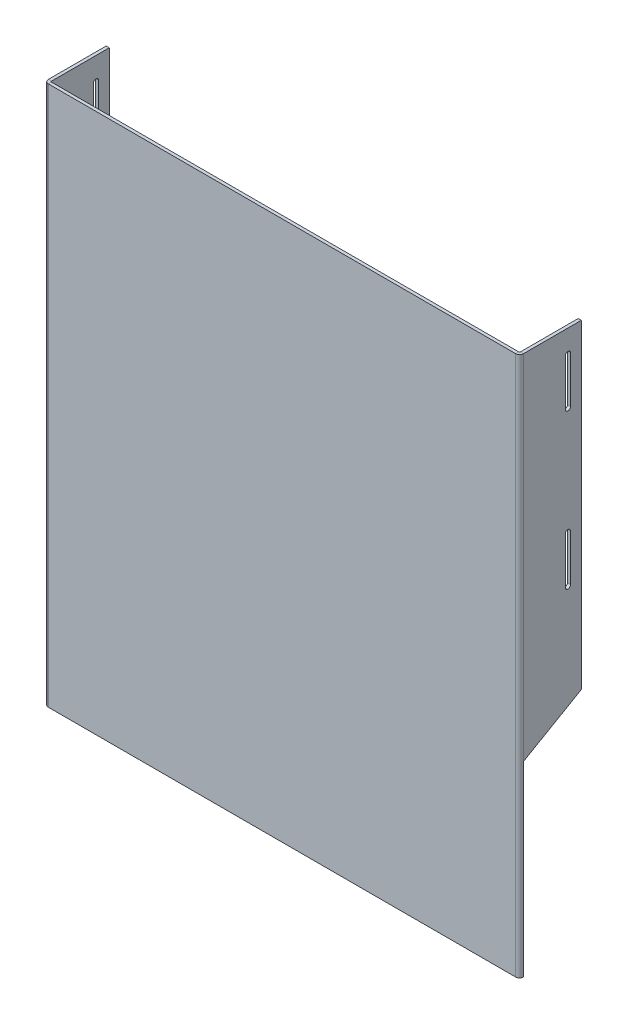
ISO-10303-21;
HEADER;
FILE_DESCRIPTION(('STEP AP214'),'2;1');
FILE_NAME('part.step','',(''),(''),'','','');
FILE_SCHEMA(('AUTOMOTIVE_DESIGN { 1 0 10303 214 1 1 1 1 }'));
ENDSEC;
DATA;
#1=APPLICATION_CONTEXT('core data for automotive mechanical design processes');
#2=APPLICATION_PROTOCOL_DEFINITION('international standard','automotive_design',2000,#1);
#3=PRODUCT_CONTEXT('',#1,'mechanical');
#4=PRODUCT('Part','Part','',(#3));
#5=PRODUCT_RELATED_PRODUCT_CATEGORY('part','',(#4));
#6=PRODUCT_DEFINITION_FORMATION('','',#4);
#7=PRODUCT_DEFINITION_CONTEXT('part definition',#1,'design');
#8=PRODUCT_DEFINITION('design','',#6,#7);
#9=PRODUCT_DEFINITION_SHAPE('','',#8);
#10=(LENGTH_UNIT() NAMED_UNIT(*) SI_UNIT(.MILLI.,.METRE.));
#11=(NAMED_UNIT(*) PLANE_ANGLE_UNIT() SI_UNIT($,.RADIAN.));
#12=(NAMED_UNIT(*) SI_UNIT($,.STERADIAN.) SOLID_ANGLE_UNIT());
#13=UNCERTAINTY_MEASURE_WITH_UNIT(LENGTH_MEASURE(1.E-05),#10,'distance_accuracy_value','');
#14=(GEOMETRIC_REPRESENTATION_CONTEXT(3) GLOBAL_UNCERTAINTY_ASSIGNED_CONTEXT((#13)) GLOBAL_UNIT_ASSIGNED_CONTEXT((#10,
#11,#12)) REPRESENTATION_CONTEXT('',''));
#15=CARTESIAN_POINT('',(0.,0.,0.));
#16=DIRECTION('',(0.,0.,1.));
#17=DIRECTION('',(1.,0.,0.));
#18=AXIS2_PLACEMENT_3D('',#15,#16,#17);
#19=CARTESIAN_POINT('',(2.5,0.,8.92239742839324E-13));
#20=DIRECTION('',(1.,0.,0.));
#21=DIRECTION('',(0.,0.,1.));
#22=AXIS2_PLACEMENT_3D('',#19,#20,#21);
#23=PLANE('',#22);
#24=DIRECTION('',(0.,-1.,0.));
#25=VECTOR('',#24,1.);
#26=CARTESIAN_POINT('',(2.50000000000001,0.,-2.49999999999999));
#27=LINE('',#26,#25);
#28=CARTESIAN_POINT('',(2.50000000000001,350.,-2.49999999999999));
#29=VERTEX_POINT('',#28);
#30=CARTESIAN_POINT('',(2.5,121.,-2.5));
#31=VERTEX_POINT('',#30);
#32=EDGE_CURVE('E373',#29,#31,#27,.T.);
#33=ORIENTED_EDGE('',*,*,#32,.T.);
#34=DIRECTION('',(0.,0.499999999999997,-0.86602540378444));
#35=VECTOR('',#34,1.);
#36=CARTESIAN_POINT('',(2.5,121.,-2.5));
#37=LINE('',#36,#35);
#38=CARTESIAN_POINT('',(2.50000000000017,142.650635094611,-40.));
#39=VERTEX_POINT('',#38);
#40=EDGE_CURVE('E348',#31,#39,#37,.T.);
#41=ORIENTED_EDGE('',*,*,#40,.T.);
#42=DIRECTION('',(0.,-1.,0.));
#43=VECTOR('',#42,1.);
#44=CARTESIAN_POINT('',(2.50000000000012,0.,-40.));
#45=LINE('',#44,#43);
#46=CARTESIAN_POINT('',(2.50000000000012,350.,-40.));
#47=VERTEX_POINT('',#46);
#48=EDGE_CURVE('E363',#39,#47,#45,.F.);
#49=ORIENTED_EDGE('',*,*,#48,.T.);
#50=DIRECTION('',(0.,0.,-1.));
#51=VECTOR('',#50,1.);
#52=CARTESIAN_POINT('',(2.5,350.,8.92239742839324E-13));
#53=LINE('',#52,#51);
#54=EDGE_CURVE('E365',#47,#29,#53,.F.);
#55=ORIENTED_EDGE('',*,*,#54,.T.);
#56=EDGE_LOOP('',(#33,#41,#49,#55));
#57=FACE_BOUND('',#56,.T.);
#58=DIRECTION('',(0.,1.,0.));
#59=VECTOR('',#58,1.);
#60=CARTESIAN_POINT('',(2.50000000000011,235.1372,-29.6559000000003));
#61=LINE('',#60,#59);
#62=CARTESIAN_POINT('',(2.50000000000011,205.1372,-29.6559000000002));
#63=VERTEX_POINT('',#62);
#64=CARTESIAN_POINT('',(2.50000000000009,235.1372,-29.6559000000003));
#65=VERTEX_POINT('',#64);
#66=EDGE_CURVE('E321',#63,#65,#61,.T.);
#67=ORIENTED_EDGE('',*,*,#66,.T.);
#68=CARTESIAN_POINT('',(2.50000000000011,235.1372,-31.3559000000002));
#69=DIRECTION('',(-1.,0.,0.));
#70=DIRECTION('',(0.,0.,1.));
#71=AXIS2_PLACEMENT_3D('',#68,#69,#70);
#72=CIRCLE('',#71,1.69999999999999);
#73=CARTESIAN_POINT('',(2.50000000000011,235.1372,-33.0559000000002));
#74=VERTEX_POINT('',#73);
#75=EDGE_CURVE('E318',#65,#74,#72,.T.);
#76=ORIENTED_EDGE('',*,*,#75,.T.);
#77=DIRECTION('',(0.,-1.,0.));
#78=VECTOR('',#77,1.);
#79=CARTESIAN_POINT('',(2.50000000000011,235.1372,-33.0559000000002));
#80=LINE('',#79,#78);
#81=CARTESIAN_POINT('',(2.50000000000011,205.1372,-33.0559000000002));
#82=VERTEX_POINT('',#81);
#83=EDGE_CURVE('E327',#74,#82,#80,.T.);
#84=ORIENTED_EDGE('',*,*,#83,.T.);
#85=CARTESIAN_POINT('',(2.50000000000011,205.1372,-31.3559000000002));
#86=DIRECTION('',(-1.,0.,0.));
#87=DIRECTION('',(0.,0.,1.));
#88=AXIS2_PLACEMENT_3D('',#85,#86,#87);
#89=CIRCLE('',#88,1.69999999999999);
#90=EDGE_CURVE('E324',#82,#63,#89,.T.);
#91=ORIENTED_EDGE('',*,*,#90,.T.);
#92=EDGE_LOOP('',(#67,#76,#84,#91));
#93=FACE_BOUND('',#92,.T.);
#94=DIRECTION('',(0.,1.,0.));
#95=VECTOR('',#94,1.);
#96=CARTESIAN_POINT('',(2.50000000000011,335.1372,-29.6559000000003));
#97=LINE('',#96,#95);
#98=CARTESIAN_POINT('',(2.50000000000011,305.1372,-29.6559000000002));
#99=VERTEX_POINT('',#98);
#100=CARTESIAN_POINT('',(2.50000000000009,335.1372,-29.6559000000003));
#101=VERTEX_POINT('',#100);
#102=EDGE_CURVE('E294',#99,#101,#97,.T.);
#103=ORIENTED_EDGE('',*,*,#102,.T.);
#104=CARTESIAN_POINT('',(2.50000000000011,335.1372,-31.3559000000002));
#105=DIRECTION('',(-1.,0.,0.));
#106=DIRECTION('',(0.,0.,1.));
#107=AXIS2_PLACEMENT_3D('',#104,#105,#106);
#108=CIRCLE('',#107,1.69999999999999);
#109=CARTESIAN_POINT('',(2.50000000000011,335.1372,-33.0559000000002));
#110=VERTEX_POINT('',#109);
#111=EDGE_CURVE('E94',#101,#110,#108,.T.);
#112=ORIENTED_EDGE('',*,*,#111,.T.);
#113=DIRECTION('',(0.,-1.,0.));
#114=VECTOR('',#113,1.);
#115=CARTESIAN_POINT('',(2.50000000000011,335.1372,-33.0559000000002));
#116=LINE('',#115,#114);
#117=CARTESIAN_POINT('',(2.50000000000011,305.1372,-33.0559000000002));
#118=VERTEX_POINT('',#117);
#119=EDGE_CURVE('E288',#110,#118,#116,.T.);
#120=ORIENTED_EDGE('',*,*,#119,.T.);
#121=CARTESIAN_POINT('',(2.50000000000011,305.1372,-31.3559000000002));
#122=DIRECTION('',(-1.,0.,0.));
#123=DIRECTION('',(0.,0.,1.));
#124=AXIS2_PLACEMENT_3D('',#121,#122,#123);
#125=CIRCLE('',#124,1.69999999999999);
#126=EDGE_CURVE('E301',#118,#99,#125,.T.);
#127=ORIENTED_EDGE('',*,*,#126,.T.);
#128=EDGE_LOOP('',(#103,#112,#120,#127));
#129=FACE_BOUND('',#128,.T.);
#130=ADVANCED_FACE('F77',(#57,#93,#129),#23,.T.);
#131=CARTESIAN_POINT('',(0.499999999999998,0.,8.85256780161638E-13));
#132=DIRECTION('',(1.,0.,0.));
#133=DIRECTION('',(0.,0.,1.));
#134=AXIS2_PLACEMENT_3D('',#131,#132,#133);
#135=PLANE('',#134);
#136=CARTESIAN_POINT('',(0.500000000000111,235.1372,-31.3559000000003));
#137=DIRECTION('',(1.,0.,0.));
#138=DIRECTION('',(0.,0.,-1.));
#139=AXIS2_PLACEMENT_3D('',#136,#137,#138);
#140=CIRCLE('',#139,1.69999999999999);
#141=CARTESIAN_POINT('',(0.500000000000111,235.1372,-33.0559000000002));
#142=VERTEX_POINT('',#141);
#143=CARTESIAN_POINT('',(0.500000000000111,235.1372,-29.6559000000003));
#144=VERTEX_POINT('',#143);
#145=EDGE_CURVE('E315',#142,#144,#140,.T.);
#146=ORIENTED_EDGE('',*,*,#145,.T.);
#147=DIRECTION('',(0.,-1.,0.));
#148=VECTOR('',#147,1.);
#149=CARTESIAN_POINT('',(0.500000000000111,235.1372,-29.6559000000003));
#150=LINE('',#149,#148);
#151=CARTESIAN_POINT('',(0.500000000000085,205.1372,-29.6559000000003));
#152=VERTEX_POINT('',#151);
#153=EDGE_CURVE('E333',#144,#152,#150,.T.);
#154=ORIENTED_EDGE('',*,*,#153,.T.);
#155=CARTESIAN_POINT('',(0.500000000000111,205.1372,-31.3559000000002));
#156=DIRECTION('',(1.,0.,0.));
#157=DIRECTION('',(0.,0.,-1.));
#158=AXIS2_PLACEMENT_3D('',#155,#156,#157);
#159=CIRCLE('',#158,1.69999999999999);
#160=CARTESIAN_POINT('',(0.500000000000116,205.1372,-33.0559000000002));
#161=VERTEX_POINT('',#160);
#162=EDGE_CURVE('E282',#152,#161,#159,.T.);
#163=ORIENTED_EDGE('',*,*,#162,.T.);
#164=DIRECTION('',(0.,1.,0.));
#165=VECTOR('',#164,1.);
#166=CARTESIAN_POINT('',(0.500000000000111,235.1372,-33.0559000000002));
#167=LINE('',#166,#165);
#168=EDGE_CURVE('E312',#161,#142,#167,.T.);
#169=ORIENTED_EDGE('',*,*,#168,.T.);
#170=EDGE_LOOP('',(#146,#154,#163,#169));
#171=FACE_BOUND('',#170,.T.);
#172=DIRECTION('',(0.,-0.499999999999997,0.86602540378444));
#173=VECTOR('',#172,1.);
#174=CARTESIAN_POINT('',(0.5,121.,-2.50000000000021));
#175=LINE('',#174,#173);
#176=CARTESIAN_POINT('',(0.500000000000115,142.650635094611,-40.));
#177=VERTEX_POINT('',#176);
#178=CARTESIAN_POINT('',(0.500000000000003,121.,-2.5));
#179=VERTEX_POINT('',#178);
#180=EDGE_CURVE('E345',#177,#179,#175,.T.);
#181=ORIENTED_EDGE('',*,*,#180,.T.);
#182=DIRECTION('',(0.,1.,0.));
#183=VECTOR('',#182,1.);
#184=CARTESIAN_POINT('',(0.500000000000006,350.,-2.5));
#185=LINE('',#184,#183);
#186=CARTESIAN_POINT('',(0.500000000000006,350.,-2.5));
#187=VERTEX_POINT('',#186);
#188=EDGE_CURVE('E379',#187,#179,#185,.F.);
#189=ORIENTED_EDGE('',*,*,#188,.F.);
#190=DIRECTION('',(0.,0.,1.));
#191=VECTOR('',#190,1.);
#192=CARTESIAN_POINT('',(0.500000000000004,350.,-2.));
#193=LINE('',#192,#191);
#194=CARTESIAN_POINT('',(0.500000000000115,350.,-40.));
#195=VERTEX_POINT('',#194);
#196=EDGE_CURVE('E370',#195,#187,#193,.T.);
#197=ORIENTED_EDGE('',*,*,#196,.F.);
#198=DIRECTION('',(0.,1.,0.));
#199=VECTOR('',#198,1.);
#200=CARTESIAN_POINT('',(0.500000000000115,350.,-40.));
#201=LINE('',#200,#199);
#202=EDGE_CURVE('E368',#177,#195,#201,.T.);
#203=ORIENTED_EDGE('',*,*,#202,.F.);
#204=EDGE_LOOP('',(#181,#189,#197,#203));
#205=FACE_BOUND('',#204,.T.);
#206=CARTESIAN_POINT('',(0.500000000000111,335.1372,-31.3559000000003));
#207=DIRECTION('',(1.,0.,0.));
#208=DIRECTION('',(0.,0.,-1.));
#209=AXIS2_PLACEMENT_3D('',#206,#207,#208);
#210=CIRCLE('',#209,1.69999999999999);
#211=CARTESIAN_POINT('',(0.500000000000111,335.1372,-33.0559000000002));
#212=VERTEX_POINT('',#211);
#213=CARTESIAN_POINT('',(0.500000000000111,335.1372,-29.6559000000003));
#214=VERTEX_POINT('',#213);
#215=EDGE_CURVE('E286',#212,#214,#210,.T.);
#216=ORIENTED_EDGE('',*,*,#215,.T.);
#217=DIRECTION('',(0.,-1.,0.));
#218=VECTOR('',#217,1.);
#219=CARTESIAN_POINT('',(0.500000000000111,335.1372,-29.6559000000003));
#220=LINE('',#219,#218);
#221=CARTESIAN_POINT('',(0.500000000000085,305.1372,-29.6559000000003));
#222=VERTEX_POINT('',#221);
#223=EDGE_CURVE('E275',#214,#222,#220,.T.);
#224=ORIENTED_EDGE('',*,*,#223,.T.);
#225=CARTESIAN_POINT('',(0.500000000000111,305.1372,-31.3559000000002));
#226=DIRECTION('',(1.,0.,0.));
#227=DIRECTION('',(0.,0.,-1.));
#228=AXIS2_PLACEMENT_3D('',#225,#226,#227);
#229=CIRCLE('',#228,1.69999999999999);
#230=CARTESIAN_POINT('',(0.500000000000116,305.1372,-33.0559000000002));
#231=VERTEX_POINT('',#230);
#232=EDGE_CURVE('E296',#222,#231,#229,.T.);
#233=ORIENTED_EDGE('',*,*,#232,.T.);
#234=DIRECTION('',(0.,1.,0.));
#235=VECTOR('',#234,1.);
#236=CARTESIAN_POINT('',(0.500000000000111,335.1372,-33.0559000000002));
#237=LINE('',#236,#235);
#238=EDGE_CURVE('E292',#231,#212,#237,.T.);
#239=ORIENTED_EDGE('',*,*,#238,.T.);
#240=EDGE_LOOP('',(#216,#224,#233,#239));
#241=FACE_BOUND('',#240,.T.);
#242=ADVANCED_FACE('F291',(#171,#205,#241),#135,.F.);
#243=CARTESIAN_POINT('',(2.50000000000011,350.,-40.));
#244=DIRECTION('',(0.,0.,1.));
#245=DIRECTION('',(1.,0.,0.));
#246=AXIS2_PLACEMENT_3D('',#243,#244,#245);
#247=PLANE('',#246);
#248=DIRECTION('',(1.,0.,0.));
#249=VECTOR('',#248,1.);
#250=CARTESIAN_POINT('',(-305.501,142.650635094611,-40.0000000000012));
#251=LINE('',#250,#249);
#252=EDGE_CURVE('E354',#177,#39,#251,.T.);
#253=ORIENTED_EDGE('',*,*,#252,.F.);
#254=ORIENTED_EDGE('',*,*,#202,.T.);
#255=DIRECTION('',(-1.,0.,0.));
#256=VECTOR('',#255,1.);
#257=CARTESIAN_POINT('',(2.50000000000013,350.,-40.));
#258=LINE('',#257,#256);
#259=EDGE_CURVE('E359',#47,#195,#258,.T.);
#260=ORIENTED_EDGE('',*,*,#259,.F.);
#261=ORIENTED_EDGE('',*,*,#48,.F.);
#262=EDGE_LOOP('',(#253,#254,#260,#261));
#263=FACE_BOUND('',#262,.T.);
#264=ADVANCED_FACE('F570',(#263),#247,.F.);
#265=CARTESIAN_POINT('',(0.,0.,-2.));
#266=DIRECTION('',(0.,-1.,0.));
#267=DIRECTION('',(1.,0.,0.));
#268=AXIS2_PLACEMENT_3D('',#265,#266,#267);
#269=PLANE('',#268);
#270=DIRECTION('',(1.,0.,0.));
#271=VECTOR('',#270,1.);
#272=CARTESIAN_POINT('',(0.,0.,0.));
#273=LINE('',#272,#271);
#274=CARTESIAN_POINT('',(-303.,0.,0.));
#275=VERTEX_POINT('',#274);
#276=CARTESIAN_POINT('',(0.,0.,0.));
#277=VERTEX_POINT('',#276);
#278=EDGE_CURVE('E509',#275,#277,#273,.T.);
#279=ORIENTED_EDGE('',*,*,#278,.F.);
#280=DIRECTION('',(0.,0.,1.));
#281=VECTOR('',#280,1.);
#282=CARTESIAN_POINT('',(-303.,0.,-2.));
#283=LINE('',#282,#281);
#284=CARTESIAN_POINT('',(-303.,0.,-2.));
#285=VERTEX_POINT('',#284);
#286=EDGE_CURVE('E86',#285,#275,#283,.T.);
#287=ORIENTED_EDGE('',*,*,#286,.F.);
#288=DIRECTION('',(1.,0.,0.));
#289=VECTOR('',#288,1.);
#290=CARTESIAN_POINT('',(0.,0.,-2.));
#291=LINE('',#290,#289);
#292=CARTESIAN_POINT('',(0.,0.,-1.99999999999999));
#293=VERTEX_POINT('',#292);
#294=EDGE_CURVE('E514',#285,#293,#291,.T.);
#295=ORIENTED_EDGE('',*,*,#294,.T.);
#296=DIRECTION('',(0.,0.,1.));
#297=VECTOR('',#296,1.);
#298=CARTESIAN_POINT('',(0.,0.,-2.));
#299=LINE('',#298,#297);
#300=EDGE_CURVE('E13',#293,#277,#299,.T.);
#301=ORIENTED_EDGE('',*,*,#300,.T.);
#302=EDGE_LOOP('',(#279,#287,#295,#301));
#303=FACE_BOUND('',#302,.T.);
#304=ADVANCED_FACE('F548',(#303),#269,.T.);
#305=CARTESIAN_POINT('',(0.,350.,-2.));
#306=DIRECTION('',(0.,1.,0.));
#307=DIRECTION('',(-1.,0.,0.));
#308=AXIS2_PLACEMENT_3D('',#305,#306,#307);
#309=PLANE('',#308);
#310=DIRECTION('',(-1.,0.,0.));
#311=VECTOR('',#310,1.);
#312=CARTESIAN_POINT('',(0.,350.,0.));
#313=LINE('',#312,#311);
#314=CARTESIAN_POINT('',(0.,350.,0.));
#315=VERTEX_POINT('',#314);
#316=CARTESIAN_POINT('',(-303.,350.,0.));
#317=VERTEX_POINT('',#316);
#318=EDGE_CURVE('E519',#315,#317,#313,.T.);
#319=ORIENTED_EDGE('',*,*,#318,.F.);
#320=DIRECTION('',(0.,0.,1.));
#321=VECTOR('',#320,1.);
#322=CARTESIAN_POINT('',(0.,350.,-2.));
#323=LINE('',#322,#321);
#324=CARTESIAN_POINT('',(0.,350.,-1.99999999999999));
#325=VERTEX_POINT('',#324);
#326=EDGE_CURVE('E81',#325,#315,#323,.T.);
#327=ORIENTED_EDGE('',*,*,#326,.F.);
#328=DIRECTION('',(-1.,0.,0.));
#329=VECTOR('',#328,1.);
#330=CARTESIAN_POINT('',(0.,350.,-2.));
#331=LINE('',#330,#329);
#332=CARTESIAN_POINT('',(-303.,350.,-2.));
#333=VERTEX_POINT('',#332);
#334=EDGE_CURVE('E508',#325,#333,#331,.T.);
#335=ORIENTED_EDGE('',*,*,#334,.T.);
#336=DIRECTION('',(0.,0.,1.));
#337=VECTOR('',#336,1.);
#338=CARTESIAN_POINT('',(-303.,350.,-2.));
#339=LINE('',#338,#337);
#340=EDGE_CURVE('E528',#333,#317,#339,.T.);
#341=ORIENTED_EDGE('',*,*,#340,.T.);
#342=EDGE_LOOP('',(#319,#327,#335,#341));
#343=FACE_BOUND('',#342,.T.);
#344=ADVANCED_FACE('F79',(#343),#309,.T.);
#345=CARTESIAN_POINT('',(0.,0.,-2.));
#346=DIRECTION('',(0.,0.,1.));
#347=DIRECTION('',(1.,0.,0.));
#348=AXIS2_PLACEMENT_3D('',#345,#346,#347);
#349=PLANE('',#348);
#350=DIRECTION('',(0.,1.,0.));
#351=VECTOR('',#350,1.);
#352=CARTESIAN_POINT('',(0.,0.,-2.));
#353=LINE('',#352,#351);
#354=EDGE_CURVE('E506',#293,#325,#353,.T.);
#355=ORIENTED_EDGE('',*,*,#354,.F.);
#356=ORIENTED_EDGE('',*,*,#294,.F.);
#357=DIRECTION('',(0.,-1.,0.));
#358=VECTOR('',#357,1.);
#359=CARTESIAN_POINT('',(-303.,0.,-2.));
#360=LINE('',#359,#358);
#361=EDGE_CURVE('E512',#333,#285,#360,.T.);
#362=ORIENTED_EDGE('',*,*,#361,.F.);
#363=ORIENTED_EDGE('',*,*,#334,.F.);
#364=EDGE_LOOP('',(#355,#356,#362,#363));
#365=FACE_BOUND('',#364,.T.);
#366=ADVANCED_FACE('F554',(#365),#349,.F.);
#367=CARTESIAN_POINT('',(0.,0.,0.));
#368=DIRECTION('',(0.,0.,1.));
#369=DIRECTION('',(1.,0.,0.));
#370=AXIS2_PLACEMENT_3D('',#367,#368,#369);
#371=PLANE('',#370);
#372=DIRECTION('',(0.,1.,0.));
#373=VECTOR('',#372,1.);
#374=CARTESIAN_POINT('',(0.,0.,0.));
#375=LINE('',#374,#373);
#376=EDGE_CURVE('E497',#277,#315,#375,.T.);
#377=ORIENTED_EDGE('',*,*,#376,.T.);
#378=ORIENTED_EDGE('',*,*,#318,.T.);
#379=DIRECTION('',(0.,-1.,0.));
#380=VECTOR('',#379,1.);
#381=CARTESIAN_POINT('',(-303.,0.,0.));
#382=LINE('',#381,#380);
#383=EDGE_CURVE('E522',#317,#275,#382,.T.);
#384=ORIENTED_EDGE('',*,*,#383,.T.);
#385=ORIENTED_EDGE('',*,*,#278,.T.);
#386=EDGE_LOOP('',(#377,#378,#384,#385));
#387=FACE_BOUND('',#386,.T.);
#388=ADVANCED_FACE('F539',(#387),#371,.T.);
#389=CARTESIAN_POINT('',(-303.,0.,-2.5));
#390=DIRECTION('',(0.,-1.,0.));
#391=DIRECTION('',(0.,0.,-1.));
#392=AXIS2_PLACEMENT_3D('',#389,#390,#391);
#393=PLANE('',#392);
#394=DIRECTION('',(-1.,0.,0.));
#395=VECTOR('',#394,1.);
#396=CARTESIAN_POINT('',(-305.5,0.,-2.5));
#397=LINE('',#396,#395);
#398=CARTESIAN_POINT('',(-303.5,0.,-2.5));
#399=VERTEX_POINT('',#398);
#400=CARTESIAN_POINT('',(-305.5,0.,-2.50000000000025));
#401=VERTEX_POINT('',#400);
#402=EDGE_CURVE('E466',#399,#401,#397,.T.);
#403=ORIENTED_EDGE('',*,*,#402,.F.);
#404=CARTESIAN_POINT('',(-303.,0.,-2.5));
#405=DIRECTION('',(0.,1.,0.));
#406=DIRECTION('',(0.,0.,1.));
#407=AXIS2_PLACEMENT_3D('',#404,#405,#406);
#408=CIRCLE('',#407,0.5);
#409=EDGE_CURVE('E501',#285,#399,#408,.F.);
#410=ORIENTED_EDGE('',*,*,#409,.F.);
#411=ORIENTED_EDGE('',*,*,#286,.T.);
#412=CARTESIAN_POINT('',(-303.,0.,-2.5));
#413=DIRECTION('',(0.,1.,0.));
#414=DIRECTION('',(0.,0.,1.));
#415=AXIS2_PLACEMENT_3D('',#412,#413,#414);
#416=CIRCLE('',#415,2.5);
#417=EDGE_CURVE('E494',#275,#401,#416,.F.);
#418=ORIENTED_EDGE('',*,*,#417,.T.);
#419=EDGE_LOOP('',(#403,#410,#411,#418));
#420=FACE_BOUND('',#419,.T.);
#421=ADVANCED_FACE('F699',(#420),#393,.T.);
#422=CARTESIAN_POINT('',(-303.,350.,-2.5));
#423=DIRECTION('',(0.,-1.,0.));
#424=DIRECTION('',(0.,0.,-1.));
#425=AXIS2_PLACEMENT_3D('',#422,#423,#424);
#426=PLANE('',#425);
#427=CARTESIAN_POINT('',(-303.,350.,-2.5));
#428=DIRECTION('',(0.,1.,0.));
#429=DIRECTION('',(0.,0.,1.));
#430=AXIS2_PLACEMENT_3D('',#427,#428,#429);
#431=CIRCLE('',#430,0.5);
#432=CARTESIAN_POINT('',(-303.5,350.,-2.5));
#433=VERTEX_POINT('',#432);
#434=EDGE_CURVE('E471',#433,#333,#431,.T.);
#435=ORIENTED_EDGE('',*,*,#434,.F.);
#436=DIRECTION('',(-1.,0.,0.));
#437=VECTOR('',#436,1.);
#438=CARTESIAN_POINT('',(-303.5,350.,-2.5));
#439=LINE('',#438,#437);
#440=CARTESIAN_POINT('',(-305.5,350.,-2.5));
#441=VERTEX_POINT('',#440);
#442=EDGE_CURVE('E486',#433,#441,#439,.T.);
#443=ORIENTED_EDGE('',*,*,#442,.T.);
#444=CARTESIAN_POINT('',(-303.,350.,-2.5));
#445=DIRECTION('',(0.,1.,0.));
#446=DIRECTION('',(0.,0.,1.));
#447=AXIS2_PLACEMENT_3D('',#444,#445,#446);
#448=CIRCLE('',#447,2.5);
#449=EDGE_CURVE('E498',#441,#317,#448,.T.);
#450=ORIENTED_EDGE('',*,*,#449,.T.);
#451=ORIENTED_EDGE('',*,*,#340,.F.);
#452=EDGE_LOOP('',(#435,#443,#450,#451));
#453=FACE_BOUND('',#452,.T.);
#454=ADVANCED_FACE('F694',(#453),#426,.F.);
#455=CARTESIAN_POINT('',(-303.,350.,-2.5));
#456=DIRECTION('',(0.,1.,0.));
#457=DIRECTION('',(-1.,0.,0.));
#458=AXIS2_PLACEMENT_3D('',#455,#456,#457);
#459=CYLINDRICAL_SURFACE('',#458,2.5);
#460=ORIENTED_EDGE('',*,*,#383,.F.);
#461=ORIENTED_EDGE('',*,*,#449,.F.);
#462=DIRECTION('',(0.,1.,0.));
#463=VECTOR('',#462,1.);
#464=CARTESIAN_POINT('',(-305.5,0.,-2.5));
#465=LINE('',#464,#463);
#466=CARTESIAN_POINT('',(-305.5,121.,-2.5));
#467=VERTEX_POINT('',#466);
#468=EDGE_CURVE('E485',#467,#441,#465,.T.);
#469=ORIENTED_EDGE('',*,*,#468,.F.);
#470=EDGE_CURVE('E482',#401,#467,#465,.T.);
#471=ORIENTED_EDGE('',*,*,#470,.F.);
#472=ORIENTED_EDGE('',*,*,#417,.F.);
#473=EDGE_LOOP('',(#460,#461,#469,#471,#472));
#474=FACE_BOUND('',#473,.T.);
#475=ADVANCED_FACE('F691',(#474),#459,.T.);
#476=CARTESIAN_POINT('',(-303.,350.,-2.5));
#477=DIRECTION('',(0.,1.,0.));
#478=DIRECTION('',(-1.,0.,0.));
#479=AXIS2_PLACEMENT_3D('',#476,#477,#478);
#480=CYLINDRICAL_SURFACE('',#479,0.5);
#481=ORIENTED_EDGE('',*,*,#361,.T.);
#482=ORIENTED_EDGE('',*,*,#409,.T.);
#483=DIRECTION('',(0.,-1.,0.));
#484=VECTOR('',#483,1.);
#485=CARTESIAN_POINT('',(-303.5,0.,-2.5));
#486=LINE('',#485,#484);
#487=CARTESIAN_POINT('',(-303.5,121.,-2.5));
#488=VERTEX_POINT('',#487);
#489=EDGE_CURVE('E489',#399,#488,#486,.F.);
#490=ORIENTED_EDGE('',*,*,#489,.T.);
#491=EDGE_CURVE('E492',#488,#433,#486,.F.);
#492=ORIENTED_EDGE('',*,*,#491,.T.);
#493=ORIENTED_EDGE('',*,*,#434,.T.);
#494=EDGE_LOOP('',(#481,#482,#490,#492,#493));
#495=FACE_BOUND('',#494,.T.);
#496=ADVANCED_FACE('F686',(#495),#480,.F.);
#497=CARTESIAN_POINT('',(-305.5,350.,-1.99999999999999));
#498=DIRECTION('',(0.,1.,0.));
#499=DIRECTION('',(0.,0.,1.));
#500=AXIS2_PLACEMENT_3D('',#497,#498,#499);
#501=PLANE('',#500);
#502=DIRECTION('',(0.,0.,1.));
#503=VECTOR('',#502,1.);
#504=CARTESIAN_POINT('',(-305.5,350.,-1.99999999999999));
#505=LINE('',#504,#503);
#506=CARTESIAN_POINT('',(-305.5,350.,-40.));
#507=VERTEX_POINT('',#506);
#508=EDGE_CURVE('E472',#507,#441,#505,.T.);
#509=ORIENTED_EDGE('',*,*,#508,.T.);
#510=ORIENTED_EDGE('',*,*,#442,.F.);
#511=DIRECTION('',(0.,0.,-1.));
#512=VECTOR('',#511,1.);
#513=CARTESIAN_POINT('',(-303.5,350.,8.85256780161638E-13));
#514=LINE('',#513,#512);
#515=CARTESIAN_POINT('',(-303.5,350.,-40.));
#516=VERTEX_POINT('',#515);
#517=EDGE_CURVE('E477',#516,#433,#514,.F.);
#518=ORIENTED_EDGE('',*,*,#517,.F.);
#519=DIRECTION('',(1.,0.,0.));
#520=VECTOR('',#519,1.);
#521=CARTESIAN_POINT('',(-305.5,350.,-40.));
#522=LINE('',#521,#520);
#523=EDGE_CURVE('E468',#507,#516,#522,.T.);
#524=ORIENTED_EDGE('',*,*,#523,.F.);
#525=EDGE_LOOP('',(#509,#510,#518,#524));
#526=FACE_BOUND('',#525,.T.);
#527=ADVANCED_FACE('F679',(#526),#501,.T.);
#528=CARTESIAN_POINT('',(-305.5,0.,8.92239742839324E-13));
#529=DIRECTION('',(-1.,0.,0.));
#530=DIRECTION('',(0.,0.,1.));
#531=AXIS2_PLACEMENT_3D('',#528,#529,#530);
#532=PLANE('',#531);
#533=CARTESIAN_POINT('',(-305.5,335.1372,-31.3559000000002));
#534=DIRECTION('',(-1.,0.,0.));
#535=DIRECTION('',(0.,0.,1.));
#536=AXIS2_PLACEMENT_3D('',#533,#534,#535);
#537=CIRCLE('',#536,1.69999999999999);
#538=CARTESIAN_POINT('',(-305.5,335.1372,-29.6559000000003));
#539=VERTEX_POINT('',#538);
#540=CARTESIAN_POINT('',(-305.5,335.1372,-33.0559000000002));
#541=VERTEX_POINT('',#540);
#542=EDGE_CURVE('E403',#539,#541,#537,.T.);
#543=ORIENTED_EDGE('',*,*,#542,.F.);
#544=DIRECTION('',(0.,1.,0.));
#545=VECTOR('',#544,1.);
#546=CARTESIAN_POINT('',(-305.5,335.1372,-29.6559000000003));
#547=LINE('',#546,#545);
#548=CARTESIAN_POINT('',(-305.5,305.1372,-29.6559000000002));
#549=VERTEX_POINT('',#548);
#550=EDGE_CURVE('E411',#549,#539,#547,.T.);
#551=ORIENTED_EDGE('',*,*,#550,.F.);
#552=CARTESIAN_POINT('',(-305.5,305.1372,-31.3559000000002));
#553=DIRECTION('',(-1.,0.,0.));
#554=DIRECTION('',(0.,0.,1.));
#555=AXIS2_PLACEMENT_3D('',#552,#553,#554);
#556=CIRCLE('',#555,1.69999999999999);
#557=CARTESIAN_POINT('',(-305.5,305.1372,-33.0559000000002));
#558=VERTEX_POINT('',#557);
#559=EDGE_CURVE('E408',#558,#549,#556,.T.);
#560=ORIENTED_EDGE('',*,*,#559,.F.);
#561=DIRECTION('',(0.,-1.,0.));
#562=VECTOR('',#561,1.);
#563=CARTESIAN_POINT('',(-305.5,335.1372,-33.0559000000002));
#564=LINE('',#563,#562);
#565=EDGE_CURVE('E405',#541,#558,#564,.T.);
#566=ORIENTED_EDGE('',*,*,#565,.F.);
#567=EDGE_LOOP('',(#543,#551,#560,#566));
#568=FACE_BOUND('',#567,.T.);
#569=CARTESIAN_POINT('',(-305.5,235.1372,-31.3559000000002));
#570=DIRECTION('',(-1.,0.,0.));
#571=DIRECTION('',(0.,0.,1.));
#572=AXIS2_PLACEMENT_3D('',#569,#570,#571);
#573=CIRCLE('',#572,1.69999999999999);
#574=CARTESIAN_POINT('',(-305.5,235.1372,-29.6559000000003));
#575=VERTEX_POINT('',#574);
#576=CARTESIAN_POINT('',(-305.5,235.1372,-33.0559000000002));
#577=VERTEX_POINT('',#576);
#578=EDGE_CURVE('E434',#575,#577,#573,.T.);
#579=ORIENTED_EDGE('',*,*,#578,.F.);
#580=DIRECTION('',(0.,1.,0.));
#581=VECTOR('',#580,1.);
#582=CARTESIAN_POINT('',(-305.5,235.1372,-29.6559000000003));
#583=LINE('',#582,#581);
#584=CARTESIAN_POINT('',(-305.5,205.1372,-29.6559000000002));
#585=VERTEX_POINT('',#584);
#586=EDGE_CURVE('E442',#585,#575,#583,.T.);
#587=ORIENTED_EDGE('',*,*,#586,.F.);
#588=CARTESIAN_POINT('',(-305.5,205.1372,-31.3559000000002));
#589=DIRECTION('',(-1.,0.,0.));
#590=DIRECTION('',(0.,0.,1.));
#591=AXIS2_PLACEMENT_3D('',#588,#589,#590);
#592=CIRCLE('',#591,1.69999999999999);
#593=CARTESIAN_POINT('',(-305.5,205.1372,-33.0559000000002));
#594=VERTEX_POINT('',#593);
#595=EDGE_CURVE('E439',#594,#585,#592,.T.);
#596=ORIENTED_EDGE('',*,*,#595,.F.);
#597=DIRECTION('',(0.,-1.,0.));
#598=VECTOR('',#597,1.);
#599=CARTESIAN_POINT('',(-305.5,235.1372,-33.0559000000002));
#600=LINE('',#599,#598);
#601=EDGE_CURVE('E436',#577,#594,#600,.T.);
#602=ORIENTED_EDGE('',*,*,#601,.F.);
#603=EDGE_LOOP('',(#579,#587,#596,#602));
#604=FACE_BOUND('',#603,.T.);
#605=DIRECTION('',(0.,0.499999999999997,-0.86602540378444));
#606=VECTOR('',#605,1.);
#607=CARTESIAN_POINT('',(-305.5,121.,-2.5));
#608=LINE('',#607,#606);
#609=CARTESIAN_POINT('',(-305.5,142.650635094611,-40.));
#610=VERTEX_POINT('',#609);
#611=EDGE_CURVE('E460',#467,#610,#608,.T.);
#612=ORIENTED_EDGE('',*,*,#611,.F.);
#613=ORIENTED_EDGE('',*,*,#468,.T.);
#614=ORIENTED_EDGE('',*,*,#508,.F.);
#615=DIRECTION('',(0.,1.,0.));
#616=VECTOR('',#615,1.);
#617=CARTESIAN_POINT('',(-305.5,350.,-40.));
#618=LINE('',#617,#616);
#619=EDGE_CURVE('E475',#610,#507,#618,.T.);
#620=ORIENTED_EDGE('',*,*,#619,.F.);
#621=EDGE_LOOP('',(#612,#613,#614,#620));
#622=FACE_BOUND('',#621,.T.);
#623=ADVANCED_FACE('F675',(#568,#604,#622),#532,.T.);
#624=CARTESIAN_POINT('',(-303.5,0.,8.85256780161638E-13));
#625=DIRECTION('',(-1.,0.,0.));
#626=DIRECTION('',(0.,0.,1.));
#627=AXIS2_PLACEMENT_3D('',#624,#625,#626);
#628=PLANE('',#627);
#629=DIRECTION('',(0.,-1.,0.));
#630=VECTOR('',#629,1.);
#631=CARTESIAN_POINT('',(-303.5,335.1372,-29.6559000000003));
#632=LINE('',#631,#630);
#633=CARTESIAN_POINT('',(-303.5,335.1372,-29.6559000000003));
#634=VERTEX_POINT('',#633);
#635=CARTESIAN_POINT('',(-303.5,305.1372,-29.6559000000003));
#636=VERTEX_POINT('',#635);
#637=EDGE_CURVE('E397',#634,#636,#632,.T.);
#638=ORIENTED_EDGE('',*,*,#637,.F.);
#639=CARTESIAN_POINT('',(-303.5,335.1372,-31.3559000000003));
#640=DIRECTION('',(-1.,0.,0.));
#641=DIRECTION('',(0.,0.,1.));
#642=AXIS2_PLACEMENT_3D('',#639,#640,#641);
#643=CIRCLE('',#642,1.69999999999999);
#644=CARTESIAN_POINT('',(-303.5,335.1372,-33.0559000000003));
#645=VERTEX_POINT('',#644);
#646=EDGE_CURVE('E400',#645,#634,#643,.F.);
#647=ORIENTED_EDGE('',*,*,#646,.F.);
#648=DIRECTION('',(0.,1.,0.));
#649=VECTOR('',#648,1.);
#650=CARTESIAN_POINT('',(-303.5,335.1372,-33.0559000000003));
#651=LINE('',#650,#649);
#652=CARTESIAN_POINT('',(-303.5,305.1372,-33.0559000000002));
#653=VERTEX_POINT('',#652);
#654=EDGE_CURVE('E417',#653,#645,#651,.T.);
#655=ORIENTED_EDGE('',*,*,#654,.F.);
#656=CARTESIAN_POINT('',(-303.5,305.1372,-31.3559000000003));
#657=DIRECTION('',(-1.,0.,0.));
#658=DIRECTION('',(0.,0.,1.));
#659=AXIS2_PLACEMENT_3D('',#656,#657,#658);
#660=CIRCLE('',#659,1.69999999999999);
#661=EDGE_CURVE('E387',#636,#653,#660,.F.);
#662=ORIENTED_EDGE('',*,*,#661,.F.);
#663=EDGE_LOOP('',(#638,#647,#655,#662));
#664=FACE_BOUND('',#663,.T.);
#665=DIRECTION('',(0.,-1.,0.));
#666=VECTOR('',#665,1.);
#667=CARTESIAN_POINT('',(-303.5,235.1372,-29.6559000000003));
#668=LINE('',#667,#666);
#669=CARTESIAN_POINT('',(-303.5,235.1372,-29.6559000000003));
#670=VERTEX_POINT('',#669);
#671=CARTESIAN_POINT('',(-303.5,205.1372,-29.6559000000003));
#672=VERTEX_POINT('',#671);
#673=EDGE_CURVE('E428',#670,#672,#668,.T.);
#674=ORIENTED_EDGE('',*,*,#673,.F.);
#675=CARTESIAN_POINT('',(-303.5,235.1372,-31.3559000000003));
#676=DIRECTION('',(-1.,0.,0.));
#677=DIRECTION('',(0.,0.,1.));
#678=AXIS2_PLACEMENT_3D('',#675,#676,#677);
#679=CIRCLE('',#678,1.69999999999999);
#680=CARTESIAN_POINT('',(-303.5,235.1372,-33.0559000000003));
#681=VERTEX_POINT('',#680);
#682=EDGE_CURVE('E431',#681,#670,#679,.F.);
#683=ORIENTED_EDGE('',*,*,#682,.F.);
#684=DIRECTION('',(0.,1.,0.));
#685=VECTOR('',#684,1.);
#686=CARTESIAN_POINT('',(-303.5,235.1372,-33.0559000000003));
#687=LINE('',#686,#685);
#688=CARTESIAN_POINT('',(-303.5,205.1372,-33.0559000000002));
#689=VERTEX_POINT('',#688);
#690=EDGE_CURVE('E448',#689,#681,#687,.T.);
#691=ORIENTED_EDGE('',*,*,#690,.F.);
#692=CARTESIAN_POINT('',(-303.5,205.1372,-31.3559000000003));
#693=DIRECTION('',(-1.,0.,0.));
#694=DIRECTION('',(0.,0.,1.));
#695=AXIS2_PLACEMENT_3D('',#692,#693,#694);
#696=CIRCLE('',#695,1.69999999999999);
#697=EDGE_CURVE('E426',#672,#689,#696,.F.);
#698=ORIENTED_EDGE('',*,*,#697,.F.);
#699=EDGE_LOOP('',(#674,#683,#691,#698));
#700=FACE_BOUND('',#699,.T.);
#701=ORIENTED_EDGE('',*,*,#491,.F.);
#702=DIRECTION('',(0.,-0.499999999999997,0.86602540378444));
#703=VECTOR('',#702,1.);
#704=CARTESIAN_POINT('',(-303.5,121.,-2.50000000000021));
#705=LINE('',#704,#703);
#706=CARTESIAN_POINT('',(-303.5,142.650635094611,-40.));
#707=VERTEX_POINT('',#706);
#708=EDGE_CURVE('E457',#707,#488,#705,.T.);
#709=ORIENTED_EDGE('',*,*,#708,.F.);
#710=DIRECTION('',(0.,-1.,0.));
#711=VECTOR('',#710,1.);
#712=CARTESIAN_POINT('',(-303.5,0.,-40.));
#713=LINE('',#712,#711);
#714=EDGE_CURVE('E480',#707,#516,#713,.F.);
#715=ORIENTED_EDGE('',*,*,#714,.T.);
#716=ORIENTED_EDGE('',*,*,#517,.T.);
#717=EDGE_LOOP('',(#701,#709,#715,#716));
#718=FACE_BOUND('',#717,.T.);
#719=ADVANCED_FACE('F678',(#664,#700,#718),#628,.F.);
#720=CARTESIAN_POINT('',(-305.5,350.,-40.));
#721=DIRECTION('',(0.,0.,-1.));
#722=DIRECTION('',(-1.,0.,0.));
#723=AXIS2_PLACEMENT_3D('',#720,#721,#722);
#724=PLANE('',#723);
#725=DIRECTION('',(-1.,0.,0.));
#726=VECTOR('',#725,1.);
#727=CARTESIAN_POINT('',(0.000999999999973245,142.650635094611,-40.0000000000012));
#728=LINE('',#727,#726);
#729=EDGE_CURVE('E463',#707,#610,#728,.T.);
#730=ORIENTED_EDGE('',*,*,#729,.T.);
#731=ORIENTED_EDGE('',*,*,#619,.T.);
#732=ORIENTED_EDGE('',*,*,#523,.T.);
#733=ORIENTED_EDGE('',*,*,#714,.F.);
#734=EDGE_LOOP('',(#730,#731,#732,#733));
#735=FACE_BOUND('',#734,.T.);
#736=ADVANCED_FACE('F670',(#735),#724,.T.);
#737=CARTESIAN_POINT('',(0.00100000000013978,121.,-2.50000000000117));
#738=DIRECTION('',(0.,0.86602540378444,0.499999999999997));
#739=DIRECTION('',(0.,-0.499999999999997,0.86602540378444));
#740=AXIS2_PLACEMENT_3D('',#737,#738,#739);
#741=PLANE('',#740);
#742=ORIENTED_EDGE('',*,*,#708,.T.);
#743=DIRECTION('',(-1.,0.,0.));
#744=VECTOR('',#743,1.);
#745=CARTESIAN_POINT('',(0.00100000000013978,121.,-2.50000000000117));
#746=LINE('',#745,#744);
#747=EDGE_CURVE('E462',#488,#467,#746,.T.);
#748=ORIENTED_EDGE('',*,*,#747,.T.);
#749=ORIENTED_EDGE('',*,*,#611,.T.);
#750=ORIENTED_EDGE('',*,*,#729,.F.);
#751=EDGE_LOOP('',(#742,#748,#749,#750));
#752=FACE_BOUND('',#751,.T.);
#753=ADVANCED_FACE('F667',(#752),#741,.F.);
#754=CARTESIAN_POINT('',(0.00100000000013978,0.,-2.50000000000142));
#755=DIRECTION('',(0.,0.,1.));
#756=DIRECTION('',(1.,0.,0.));
#757=AXIS2_PLACEMENT_3D('',#754,#755,#756);
#758=PLANE('',#757);
#759=ORIENTED_EDGE('',*,*,#489,.F.);
#760=ORIENTED_EDGE('',*,*,#402,.T.);
#761=ORIENTED_EDGE('',*,*,#470,.T.);
#762=ORIENTED_EDGE('',*,*,#747,.F.);
#763=EDGE_LOOP('',(#759,#760,#761,#762));
#764=FACE_BOUND('',#763,.T.);
#765=ADVANCED_FACE('F665',(#764),#758,.F.);
#766=CARTESIAN_POINT('',(0.00100000000002876,235.1372,-31.3559000000014));
#767=DIRECTION('',(-1.,0.,0.));
#768=DIRECTION('',(0.,0.,1.));
#769=AXIS2_PLACEMENT_3D('',#766,#767,#768);
#770=CYLINDRICAL_SURFACE('',#769,1.69999999999999);
#771=ORIENTED_EDGE('',*,*,#682,.T.);
#772=DIRECTION('',(-1.,0.,0.));
#773=VECTOR('',#772,1.);
#774=CARTESIAN_POINT('',(0.00100000000002876,235.1372,-29.6559000000014));
#775=LINE('',#774,#773);
#776=EDGE_CURVE('E446',#670,#575,#775,.T.);
#777=ORIENTED_EDGE('',*,*,#776,.T.);
#778=ORIENTED_EDGE('',*,*,#578,.T.);
#779=DIRECTION('',(-1.,0.,0.));
#780=VECTOR('',#779,1.);
#781=CARTESIAN_POINT('',(0.00100000000002876,235.1372,-33.0559000000014));
#782=LINE('',#781,#780);
#783=EDGE_CURVE('E445',#681,#577,#782,.T.);
#784=ORIENTED_EDGE('',*,*,#783,.F.);
#785=EDGE_LOOP('',(#771,#777,#778,#784));
#786=FACE_BOUND('',#785,.T.);
#787=ADVANCED_FACE('F655',(#786),#770,.F.);
#788=CARTESIAN_POINT('',(0.00100000000002876,235.1372,-29.6559000000014));
#789=DIRECTION('',(0.,0.,1.));
#790=DIRECTION('',(1.,0.,0.));
#791=AXIS2_PLACEMENT_3D('',#788,#789,#790);
#792=PLANE('',#791);
#793=ORIENTED_EDGE('',*,*,#673,.T.);
#794=DIRECTION('',(-1.,0.,0.));
#795=VECTOR('',#794,1.);
#796=CARTESIAN_POINT('',(0.00100000000002876,205.1372,-29.6559000000014));
#797=LINE('',#796,#795);
#798=EDGE_CURVE('E449',#672,#585,#797,.T.);
#799=ORIENTED_EDGE('',*,*,#798,.T.);
#800=ORIENTED_EDGE('',*,*,#586,.T.);
#801=ORIENTED_EDGE('',*,*,#776,.F.);
#802=EDGE_LOOP('',(#793,#799,#800,#801));
#803=FACE_BOUND('',#802,.T.);
#804=ADVANCED_FACE('F651',(#803),#792,.F.);
#805=CARTESIAN_POINT('',(0.00100000000002876,205.1372,-31.3559000000014));
#806=DIRECTION('',(-1.,0.,0.));
#807=DIRECTION('',(0.,0.,1.));
#808=AXIS2_PLACEMENT_3D('',#805,#806,#807);
#809=CYLINDRICAL_SURFACE('',#808,1.69999999999999);
#810=ORIENTED_EDGE('',*,*,#697,.T.);
#811=DIRECTION('',(-1.,0.,0.));
#812=VECTOR('',#811,1.);
#813=CARTESIAN_POINT('',(0.00100000000002876,205.1372,-33.0559000000014));
#814=LINE('',#813,#812);
#815=EDGE_CURVE('E451',#689,#594,#814,.T.);
#816=ORIENTED_EDGE('',*,*,#815,.T.);
#817=ORIENTED_EDGE('',*,*,#595,.T.);
#818=ORIENTED_EDGE('',*,*,#798,.F.);
#819=EDGE_LOOP('',(#810,#816,#817,#818));
#820=FACE_BOUND('',#819,.T.);
#821=ADVANCED_FACE('F654',(#820),#809,.F.);
#822=CARTESIAN_POINT('',(0.00100000000002876,235.1372,-33.0559000000014));
#823=DIRECTION('',(0.,0.,-1.));
#824=DIRECTION('',(-1.,0.,0.));
#825=AXIS2_PLACEMENT_3D('',#822,#823,#824);
#826=PLANE('',#825);
#827=ORIENTED_EDGE('',*,*,#690,.T.);
#828=ORIENTED_EDGE('',*,*,#783,.T.);
#829=ORIENTED_EDGE('',*,*,#601,.T.);
#830=ORIENTED_EDGE('',*,*,#815,.F.);
#831=EDGE_LOOP('',(#827,#828,#829,#830));
#832=FACE_BOUND('',#831,.T.);
#833=ADVANCED_FACE('F649',(#832),#826,.F.);
#834=CARTESIAN_POINT('',(0.00100000000002876,335.1372,-31.3559000000014));
#835=DIRECTION('',(-1.,0.,0.));
#836=DIRECTION('',(0.,0.,1.));
#837=AXIS2_PLACEMENT_3D('',#834,#835,#836);
#838=CYLINDRICAL_SURFACE('',#837,1.69999999999999);
#839=ORIENTED_EDGE('',*,*,#646,.T.);
#840=DIRECTION('',(-1.,0.,0.));
#841=VECTOR('',#840,1.);
#842=CARTESIAN_POINT('',(0.00100000000002876,335.1372,-29.6559000000014));
#843=LINE('',#842,#841);
#844=EDGE_CURVE('E415',#634,#539,#843,.T.);
#845=ORIENTED_EDGE('',*,*,#844,.T.);
#846=ORIENTED_EDGE('',*,*,#542,.T.);
#847=DIRECTION('',(-1.,0.,0.));
#848=VECTOR('',#847,1.);
#849=CARTESIAN_POINT('',(0.00100000000002876,335.1372,-33.0559000000014));
#850=LINE('',#849,#848);
#851=EDGE_CURVE('E414',#645,#541,#850,.T.);
#852=ORIENTED_EDGE('',*,*,#851,.F.);
#853=EDGE_LOOP('',(#839,#845,#846,#852));
#854=FACE_BOUND('',#853,.T.);
#855=ADVANCED_FACE('F639',(#854),#838,.F.);
#856=CARTESIAN_POINT('',(0.00100000000002876,335.1372,-29.6559000000014));
#857=DIRECTION('',(0.,0.,1.));
#858=DIRECTION('',(1.,0.,0.));
#859=AXIS2_PLACEMENT_3D('',#856,#857,#858);
#860=PLANE('',#859);
#861=ORIENTED_EDGE('',*,*,#637,.T.);
#862=DIRECTION('',(-1.,0.,0.));
#863=VECTOR('',#862,1.);
#864=CARTESIAN_POINT('',(0.00100000000002876,305.1372,-29.6559000000014));
#865=LINE('',#864,#863);
#866=EDGE_CURVE('E418',#636,#549,#865,.T.);
#867=ORIENTED_EDGE('',*,*,#866,.T.);
#868=ORIENTED_EDGE('',*,*,#550,.T.);
#869=ORIENTED_EDGE('',*,*,#844,.F.);
#870=EDGE_LOOP('',(#861,#867,#868,#869));
#871=FACE_BOUND('',#870,.T.);
#872=ADVANCED_FACE('F635',(#871),#860,.F.);
#873=CARTESIAN_POINT('',(0.00100000000002876,305.1372,-31.3559000000014));
#874=DIRECTION('',(-1.,0.,0.));
#875=DIRECTION('',(0.,0.,1.));
#876=AXIS2_PLACEMENT_3D('',#873,#874,#875);
#877=CYLINDRICAL_SURFACE('',#876,1.69999999999999);
#878=ORIENTED_EDGE('',*,*,#661,.T.);
#879=DIRECTION('',(-1.,0.,0.));
#880=VECTOR('',#879,1.);
#881=CARTESIAN_POINT('',(0.00100000000002876,305.1372,-33.0559000000014));
#882=LINE('',#881,#880);
#883=EDGE_CURVE('E420',#653,#558,#882,.T.);
#884=ORIENTED_EDGE('',*,*,#883,.T.);
#885=ORIENTED_EDGE('',*,*,#559,.T.);
#886=ORIENTED_EDGE('',*,*,#866,.F.);
#887=EDGE_LOOP('',(#878,#884,#885,#886));
#888=FACE_BOUND('',#887,.T.);
#889=ADVANCED_FACE('F638',(#888),#877,.F.);
#890=CARTESIAN_POINT('',(0.00100000000002876,335.1372,-33.0559000000014));
#891=DIRECTION('',(0.,0.,-1.));
#892=DIRECTION('',(-1.,0.,0.));
#893=AXIS2_PLACEMENT_3D('',#890,#891,#892);
#894=PLANE('',#893);
#895=ORIENTED_EDGE('',*,*,#654,.T.);
#896=ORIENTED_EDGE('',*,*,#851,.T.);
#897=ORIENTED_EDGE('',*,*,#565,.T.);
#898=ORIENTED_EDGE('',*,*,#883,.F.);
#899=EDGE_LOOP('',(#895,#896,#897,#898));
#900=FACE_BOUND('',#899,.T.);
#901=ADVANCED_FACE('F632',(#900),#894,.F.);
#902=CARTESIAN_POINT('',(0.,350.,-2.5));
#903=DIRECTION('',(0.,1.,0.));
#904=DIRECTION('',(0.,0.,1.));
#905=AXIS2_PLACEMENT_3D('',#902,#903,#904);
#906=PLANE('',#905);
#907=DIRECTION('',(-1.,0.,0.));
#908=VECTOR('',#907,1.);
#909=CARTESIAN_POINT('',(2.5,350.,-2.49999999999999));
#910=LINE('',#909,#908);
#911=EDGE_CURVE('E357',#187,#29,#910,.F.);
#912=ORIENTED_EDGE('',*,*,#911,.F.);
#913=CARTESIAN_POINT('',(0.,350.,-2.5));
#914=DIRECTION('',(0.,-1.,0.));
#915=DIRECTION('',(0.,0.,-1.));
#916=AXIS2_PLACEMENT_3D('',#913,#914,#915);
#917=CIRCLE('',#916,0.500000000000006);
#918=EDGE_CURVE('E391',#325,#187,#917,.F.);
#919=ORIENTED_EDGE('',*,*,#918,.F.);
#920=ORIENTED_EDGE('',*,*,#326,.T.);
#921=CARTESIAN_POINT('',(0.,350.,-2.5));
#922=DIRECTION('',(0.,-1.,0.));
#923=DIRECTION('',(0.,0.,-1.));
#924=AXIS2_PLACEMENT_3D('',#921,#922,#923);
#925=CIRCLE('',#924,2.50000000000001);
#926=EDGE_CURVE('E384',#315,#29,#925,.F.);
#927=ORIENTED_EDGE('',*,*,#926,.T.);
#928=EDGE_LOOP('',(#912,#919,#920,#927));
#929=FACE_BOUND('',#928,.T.);
#930=ADVANCED_FACE('F536',(#929),#906,.T.);
#931=CARTESIAN_POINT('',(0.,0.,-2.5));
#932=DIRECTION('',(0.,1.,0.));
#933=DIRECTION('',(0.,0.,1.));
#934=AXIS2_PLACEMENT_3D('',#931,#932,#933);
#935=PLANE('',#934);
#936=CARTESIAN_POINT('',(0.,0.,-2.5));
#937=DIRECTION('',(0.,-1.,0.));
#938=DIRECTION('',(0.,0.,-1.));
#939=AXIS2_PLACEMENT_3D('',#936,#937,#938);
#940=CIRCLE('',#939,0.500000000000006);
#941=CARTESIAN_POINT('',(0.500000000000006,0.,-2.5));
#942=VERTEX_POINT('',#941);
#943=EDGE_CURVE('E362',#942,#293,#940,.T.);
#944=ORIENTED_EDGE('',*,*,#943,.F.);
#945=DIRECTION('',(-1.,0.,0.));
#946=VECTOR('',#945,1.);
#947=CARTESIAN_POINT('',(0.5,0.,-2.5));
#948=LINE('',#947,#946);
#949=CARTESIAN_POINT('',(2.5,0.,-2.50000000000025));
#950=VERTEX_POINT('',#949);
#951=EDGE_CURVE('E376',#942,#950,#948,.F.);
#952=ORIENTED_EDGE('',*,*,#951,.T.);
#953=CARTESIAN_POINT('',(0.,0.,-2.5));
#954=DIRECTION('',(0.,-1.,0.));
#955=DIRECTION('',(0.,0.,-1.));
#956=AXIS2_PLACEMENT_3D('',#953,#954,#955);
#957=CIRCLE('',#956,2.50000000000001);
#958=EDGE_CURVE('E388',#950,#277,#957,.T.);
#959=ORIENTED_EDGE('',*,*,#958,.T.);
#960=ORIENTED_EDGE('',*,*,#300,.F.);
#961=EDGE_LOOP('',(#944,#952,#959,#960));
#962=FACE_BOUND('',#961,.T.);
#963=ADVANCED_FACE('F546',(#962),#935,.F.);
#964=CARTESIAN_POINT('',(0.,0.,-2.5));
#965=DIRECTION('',(0.,-1.,0.));
#966=DIRECTION('',(1.,0.,0.));
#967=AXIS2_PLACEMENT_3D('',#964,#965,#966);
#968=CYLINDRICAL_SURFACE('',#967,2.50000000000001);
#969=ORIENTED_EDGE('',*,*,#376,.F.);
#970=ORIENTED_EDGE('',*,*,#958,.F.);
#971=DIRECTION('',(0.,1.,0.));
#972=VECTOR('',#971,1.);
#973=CARTESIAN_POINT('',(2.5,0.,-2.50000000000025));
#974=LINE('',#973,#972);
#975=EDGE_CURVE('E351',#950,#31,#974,.T.);
#976=ORIENTED_EDGE('',*,*,#975,.T.);
#977=ORIENTED_EDGE('',*,*,#32,.F.);
#978=ORIENTED_EDGE('',*,*,#926,.F.);
#979=EDGE_LOOP('',(#969,#970,#976,#977,#978));
#980=FACE_BOUND('',#979,.T.);
#981=ADVANCED_FACE('F543',(#980),#968,.T.);
#982=CARTESIAN_POINT('',(0.,0.,-2.5));
#983=DIRECTION('',(0.,-1.,0.));
#984=DIRECTION('',(1.,0.,0.));
#985=AXIS2_PLACEMENT_3D('',#982,#983,#984);
#986=CYLINDRICAL_SURFACE('',#985,0.500000000000006);
#987=ORIENTED_EDGE('',*,*,#354,.T.);
#988=ORIENTED_EDGE('',*,*,#918,.T.);
#989=ORIENTED_EDGE('',*,*,#188,.T.);
#990=DIRECTION('',(0.,1.,0.));
#991=VECTOR('',#990,1.);
#992=CARTESIAN_POINT('',(0.500000000000006,350.,-2.5));
#993=LINE('',#992,#991);
#994=EDGE_CURVE('E342',#179,#942,#993,.F.);
#995=ORIENTED_EDGE('',*,*,#994,.T.);
#996=ORIENTED_EDGE('',*,*,#943,.T.);
#997=EDGE_LOOP('',(#987,#988,#989,#995,#996));
#998=FACE_BOUND('',#997,.T.);
#999=ADVANCED_FACE('F556',(#998),#986,.F.);
#1000=CARTESIAN_POINT('',(2.5,350.,-1.99999999999999));
#1001=DIRECTION('',(0.,-1.,0.));
#1002=DIRECTION('',(1.,0.,0.));
#1003=AXIS2_PLACEMENT_3D('',#1000,#1001,#1002);
#1004=PLANE('',#1003);
#1005=ORIENTED_EDGE('',*,*,#911,.T.);
#1006=ORIENTED_EDGE('',*,*,#54,.F.);
#1007=ORIENTED_EDGE('',*,*,#259,.T.);
#1008=ORIENTED_EDGE('',*,*,#196,.T.);
#1009=EDGE_LOOP('',(#1005,#1006,#1007,#1008));
#1010=FACE_BOUND('',#1009,.T.);
#1011=ADVANCED_FACE('F574',(#1010),#1004,.F.);
#1012=CARTESIAN_POINT('',(-305.501,0.,-2.50000000000143));
#1013=DIRECTION('',(0.,0.,-1.));
#1014=DIRECTION('',(-1.,0.,0.));
#1015=AXIS2_PLACEMENT_3D('',#1012,#1013,#1014);
#1016=PLANE('',#1015);
#1017=DIRECTION('',(1.,0.,0.));
#1018=VECTOR('',#1017,1.);
#1019=CARTESIAN_POINT('',(-305.501,121.,-2.50000000000118));
#1020=LINE('',#1019,#1018);
#1021=EDGE_CURVE('E355',#179,#31,#1020,.T.);
#1022=ORIENTED_EDGE('',*,*,#1021,.T.);
#1023=ORIENTED_EDGE('',*,*,#975,.F.);
#1024=ORIENTED_EDGE('',*,*,#951,.F.);
#1025=ORIENTED_EDGE('',*,*,#994,.F.);
#1026=EDGE_LOOP('',(#1022,#1023,#1024,#1025));
#1027=FACE_BOUND('',#1026,.T.);
#1028=ADVANCED_FACE('F560',(#1027),#1016,.T.);
#1029=CARTESIAN_POINT('',(-305.501,121.,-2.50000000000118));
#1030=DIRECTION('',(0.,-0.86602540378444,-0.499999999999997));
#1031=DIRECTION('',(0.,0.499999999999997,-0.86602540378444));
#1032=AXIS2_PLACEMENT_3D('',#1029,#1030,#1031);
#1033=PLANE('',#1032);
#1034=ORIENTED_EDGE('',*,*,#252,.T.);
#1035=ORIENTED_EDGE('',*,*,#40,.F.);
#1036=ORIENTED_EDGE('',*,*,#1021,.F.);
#1037=ORIENTED_EDGE('',*,*,#180,.F.);
#1038=EDGE_LOOP('',(#1034,#1035,#1036,#1037));
#1039=FACE_BOUND('',#1038,.T.);
#1040=ADVANCED_FACE('F563',(#1039),#1033,.T.);
#1041=CARTESIAN_POINT('',(-305.501,235.1372,-31.3559000000014));
#1042=DIRECTION('',(1.,0.,0.));
#1043=DIRECTION('',(0.,0.,-1.));
#1044=AXIS2_PLACEMENT_3D('',#1041,#1042,#1043);
#1045=CYLINDRICAL_SURFACE('',#1044,1.69999999999999);
#1046=DIRECTION('',(1.,0.,0.));
#1047=VECTOR('',#1046,1.);
#1048=CARTESIAN_POINT('',(-305.501,235.1372,-33.0559000000014));
#1049=LINE('',#1048,#1047);
#1050=EDGE_CURVE('E331',#142,#74,#1049,.T.);
#1051=ORIENTED_EDGE('',*,*,#1050,.T.);
#1052=ORIENTED_EDGE('',*,*,#75,.F.);
#1053=DIRECTION('',(1.,0.,0.));
#1054=VECTOR('',#1053,1.);
#1055=CARTESIAN_POINT('',(-305.501,235.1372,-29.6559000000014));
#1056=LINE('',#1055,#1054);
#1057=EDGE_CURVE('E330',#144,#65,#1056,.T.);
#1058=ORIENTED_EDGE('',*,*,#1057,.F.);
#1059=ORIENTED_EDGE('',*,*,#145,.F.);
#1060=EDGE_LOOP('',(#1051,#1052,#1058,#1059));
#1061=FACE_BOUND('',#1060,.T.);
#1062=ADVANCED_FACE('F604',(#1061),#1045,.F.);
#1063=CARTESIAN_POINT('',(-305.501,235.1372,-33.0559000000014));
#1064=DIRECTION('',(0.,0.,1.));
#1065=DIRECTION('',(1.,0.,0.));
#1066=AXIS2_PLACEMENT_3D('',#1063,#1064,#1065);
#1067=PLANE('',#1066);
#1068=DIRECTION('',(1.,0.,0.));
#1069=VECTOR('',#1068,1.);
#1070=CARTESIAN_POINT('',(-305.501,205.1372,-33.0559000000014));
#1071=LINE('',#1070,#1069);
#1072=EDGE_CURVE('E334',#161,#82,#1071,.T.);
#1073=ORIENTED_EDGE('',*,*,#1072,.T.);
#1074=ORIENTED_EDGE('',*,*,#83,.F.);
#1075=ORIENTED_EDGE('',*,*,#1050,.F.);
#1076=ORIENTED_EDGE('',*,*,#168,.F.);
#1077=EDGE_LOOP('',(#1073,#1074,#1075,#1076));
#1078=FACE_BOUND('',#1077,.T.);
#1079=ADVANCED_FACE('F600',(#1078),#1067,.T.);
#1080=CARTESIAN_POINT('',(-305.501,205.1372,-31.3559000000014));
#1081=DIRECTION('',(1.,0.,0.));
#1082=DIRECTION('',(0.,0.,-1.));
#1083=AXIS2_PLACEMENT_3D('',#1080,#1081,#1082);
#1084=CYLINDRICAL_SURFACE('',#1083,1.69999999999999);
#1085=DIRECTION('',(1.,0.,0.));
#1086=VECTOR('',#1085,1.);
#1087=CARTESIAN_POINT('',(-305.501,205.1372,-29.6559000000014));
#1088=LINE('',#1087,#1086);
#1089=EDGE_CURVE('E336',#152,#63,#1088,.T.);
#1090=ORIENTED_EDGE('',*,*,#1089,.T.);
#1091=ORIENTED_EDGE('',*,*,#90,.F.);
#1092=ORIENTED_EDGE('',*,*,#1072,.F.);
#1093=ORIENTED_EDGE('',*,*,#162,.F.);
#1094=EDGE_LOOP('',(#1090,#1091,#1092,#1093));
#1095=FACE_BOUND('',#1094,.T.);
#1096=ADVANCED_FACE('F603',(#1095),#1084,.F.);
#1097=CARTESIAN_POINT('',(-305.501,235.1372,-29.6559000000014));
#1098=DIRECTION('',(0.,0.,-1.));
#1099=DIRECTION('',(-1.,0.,0.));
#1100=AXIS2_PLACEMENT_3D('',#1097,#1098,#1099);
#1101=PLANE('',#1100);
#1102=ORIENTED_EDGE('',*,*,#1057,.T.);
#1103=ORIENTED_EDGE('',*,*,#66,.F.);
#1104=ORIENTED_EDGE('',*,*,#1089,.F.);
#1105=ORIENTED_EDGE('',*,*,#153,.F.);
#1106=EDGE_LOOP('',(#1102,#1103,#1104,#1105));
#1107=FACE_BOUND('',#1106,.T.);
#1108=ADVANCED_FACE('F595',(#1107),#1101,.T.);
#1109=CARTESIAN_POINT('',(-305.501,335.1372,-31.3559000000014));
#1110=DIRECTION('',(1.,0.,0.));
#1111=DIRECTION('',(0.,0.,-1.));
#1112=AXIS2_PLACEMENT_3D('',#1109,#1110,#1111);
#1113=CYLINDRICAL_SURFACE('',#1112,1.69999999999999);
#1114=DIRECTION('',(1.,0.,0.));
#1115=VECTOR('',#1114,1.);
#1116=CARTESIAN_POINT('',(-305.501,335.1372,-33.0559000000014));
#1117=LINE('',#1116,#1115);
#1118=EDGE_CURVE('E283',#212,#110,#1117,.T.);
#1119=ORIENTED_EDGE('',*,*,#1118,.T.);
#1120=ORIENTED_EDGE('',*,*,#111,.F.);
#1121=DIRECTION('',(1.,0.,0.));
#1122=VECTOR('',#1121,1.);
#1123=CARTESIAN_POINT('',(-305.501,335.1372,-29.6559000000014));
#1124=LINE('',#1123,#1122);
#1125=EDGE_CURVE('E277',#214,#101,#1124,.T.);
#1126=ORIENTED_EDGE('',*,*,#1125,.F.);
#1127=ORIENTED_EDGE('',*,*,#215,.F.);
#1128=EDGE_LOOP('',(#1119,#1120,#1126,#1127));
#1129=FACE_BOUND('',#1128,.T.);
#1130=ADVANCED_FACE('F285',(#1129),#1113,.F.);
#1131=CARTESIAN_POINT('',(-305.501,335.1372,-33.0559000000014));
#1132=DIRECTION('',(0.,0.,1.));
#1133=DIRECTION('',(1.,0.,0.));
#1134=AXIS2_PLACEMENT_3D('',#1131,#1132,#1133);
#1135=PLANE('',#1134);
#1136=DIRECTION('',(1.,0.,0.));
#1137=VECTOR('',#1136,1.);
#1138=CARTESIAN_POINT('',(-305.501,305.1372,-33.0559000000014));
#1139=LINE('',#1138,#1137);
#1140=EDGE_CURVE('E307',#231,#118,#1139,.T.);
#1141=ORIENTED_EDGE('',*,*,#1140,.T.);
#1142=ORIENTED_EDGE('',*,*,#119,.F.);
#1143=ORIENTED_EDGE('',*,*,#1118,.F.);
#1144=ORIENTED_EDGE('',*,*,#238,.F.);
#1145=EDGE_LOOP('',(#1141,#1142,#1143,#1144));
#1146=FACE_BOUND('',#1145,.T.);
#1147=ADVANCED_FACE('F587',(#1146),#1135,.T.);
#1148=CARTESIAN_POINT('',(-305.501,305.1372,-31.3559000000014));
#1149=DIRECTION('',(1.,0.,0.));
#1150=DIRECTION('',(0.,0.,-1.));
#1151=AXIS2_PLACEMENT_3D('',#1148,#1149,#1150);
#1152=CYLINDRICAL_SURFACE('',#1151,1.69999999999999);
#1153=DIRECTION('',(1.,0.,0.));
#1154=VECTOR('',#1153,1.);
#1155=CARTESIAN_POINT('',(-305.501,305.1372,-29.6559000000014));
#1156=LINE('',#1155,#1154);
#1157=EDGE_CURVE('E102',#222,#99,#1156,.T.);
#1158=ORIENTED_EDGE('',*,*,#1157,.T.);
#1159=ORIENTED_EDGE('',*,*,#126,.F.);
#1160=ORIENTED_EDGE('',*,*,#1140,.F.);
#1161=ORIENTED_EDGE('',*,*,#232,.F.);
#1162=EDGE_LOOP('',(#1158,#1159,#1160,#1161));
#1163=FACE_BOUND('',#1162,.T.);
#1164=ADVANCED_FACE('F585',(#1163),#1152,.F.);
#1165=CARTESIAN_POINT('',(-305.501,335.1372,-29.6559000000014));
#1166=DIRECTION('',(0.,0.,-1.));
#1167=DIRECTION('',(-1.,0.,0.));
#1168=AXIS2_PLACEMENT_3D('',#1165,#1166,#1167);
#1169=PLANE('',#1168);
#1170=ORIENTED_EDGE('',*,*,#1125,.T.);
#1171=ORIENTED_EDGE('',*,*,#102,.F.);
#1172=ORIENTED_EDGE('',*,*,#1157,.F.);
#1173=ORIENTED_EDGE('',*,*,#223,.F.);
#1174=EDGE_LOOP('',(#1170,#1171,#1172,#1173));
#1175=FACE_BOUND('',#1174,.T.);
#1176=ADVANCED_FACE('F276',(#1175),#1169,.T.);
#1177=CLOSED_SHELL('',(#130,#242,#264,#304,#344,#366,#388,#421,#454,#475,#496,#527,#623,#719,
#736,#753,#765,#787,#804,#821,#833,#855,#872,#889,#901,#930,#963,#981,#999,#1011,#1028,#1040,
#1062,#1079,#1096,#1108,#1130,#1147,#1164,#1176));
#1178=MANIFOLD_SOLID_BREP('B2',#1177);
#1179=ADVANCED_BREP_SHAPE_REPRESENTATION('',(#18,#1178),#14);
#1180=SHAPE_DEFINITION_REPRESENTATION(#9,#1179);
ENDSEC;
END-ISO-10303-21;
